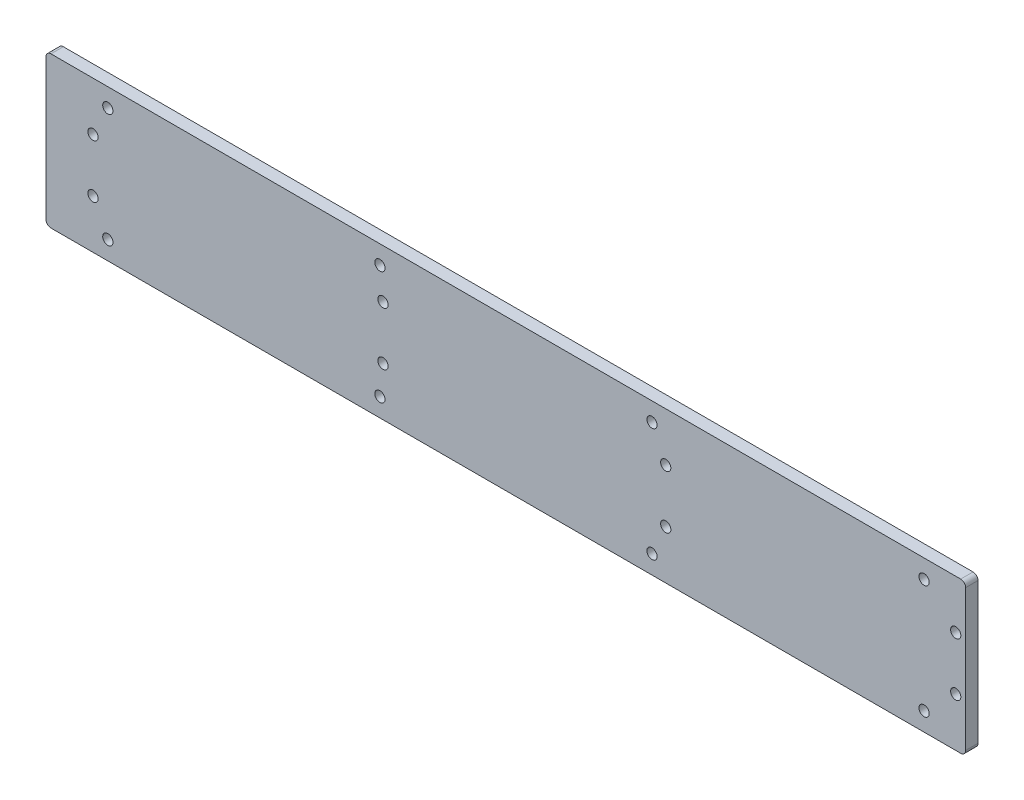
ISO-10303-21;
HEADER;
FILE_DESCRIPTION(('STEP AP214'),'2;1');
FILE_NAME('part.step','',(''),(''),'','','');
FILE_SCHEMA(('AUTOMOTIVE_DESIGN { 1 0 10303 214 1 1 1 1 }'));
ENDSEC;
DATA;
#1=APPLICATION_CONTEXT('core data for automotive mechanical design processes');
#2=APPLICATION_PROTOCOL_DEFINITION('international standard','automotive_design',2000,#1);
#3=PRODUCT_CONTEXT('',#1,'mechanical');
#4=PRODUCT('Part','Part','',(#3));
#5=PRODUCT_RELATED_PRODUCT_CATEGORY('part','',(#4));
#6=PRODUCT_DEFINITION_FORMATION('','',#4);
#7=PRODUCT_DEFINITION_CONTEXT('part definition',#1,'design');
#8=PRODUCT_DEFINITION('design','',#6,#7);
#9=PRODUCT_DEFINITION_SHAPE('','',#8);
#10=(LENGTH_UNIT() NAMED_UNIT(*) SI_UNIT(.MILLI.,.METRE.));
#11=(NAMED_UNIT(*) PLANE_ANGLE_UNIT() SI_UNIT($,.RADIAN.));
#12=(NAMED_UNIT(*) SI_UNIT($,.STERADIAN.) SOLID_ANGLE_UNIT());
#13=UNCERTAINTY_MEASURE_WITH_UNIT(LENGTH_MEASURE(1.E-05),#10,'distance_accuracy_value','');
#14=(GEOMETRIC_REPRESENTATION_CONTEXT(3) GLOBAL_UNCERTAINTY_ASSIGNED_CONTEXT((#13)) GLOBAL_UNIT_ASSIGNED_CONTEXT((#10,
#11,#12)) REPRESENTATION_CONTEXT('',''));
#15=CARTESIAN_POINT('',(0.,0.,0.));
#16=DIRECTION('',(0.,0.,1.));
#17=DIRECTION('',(1.,0.,0.));
#18=AXIS2_PLACEMENT_3D('',#15,#16,#17);
#19=CARTESIAN_POINT('',(-245.618,38.735,6.35));
#20=DIRECTION('',(0.,-1.,0.));
#21=DIRECTION('',(0.,0.,-1.));
#22=AXIS2_PLACEMENT_3D('',#19,#20,#21);
#23=PLANE('',#22);
#24=DIRECTION('',(-1.,0.,0.));
#25=VECTOR('',#24,1.);
#26=CARTESIAN_POINT('',(-245.618,38.735,6.35));
#27=LINE('',#26,#25);
#28=CARTESIAN_POINT('',(224.028,38.735,6.35));
#29=VERTEX_POINT('',#28);
#30=CARTESIAN_POINT('',(-243.078,38.735,6.35));
#31=VERTEX_POINT('',#30);
#32=EDGE_CURVE('E138',#29,#31,#27,.T.);
#33=ORIENTED_EDGE('',*,*,#32,.F.);
#34=DIRECTION('',(0.,0.,-1.));
#35=VECTOR('',#34,1.);
#36=CARTESIAN_POINT('',(224.028,38.735,6.35));
#37=LINE('',#36,#35);
#38=CARTESIAN_POINT('',(224.028,38.735,0.));
#39=VERTEX_POINT('',#38);
#40=EDGE_CURVE('E173',#29,#39,#37,.T.);
#41=ORIENTED_EDGE('',*,*,#40,.T.);
#42=DIRECTION('',(-1.,0.,0.));
#43=VECTOR('',#42,1.);
#44=CARTESIAN_POINT('',(-245.618,38.735,0.));
#45=LINE('',#44,#43);
#46=CARTESIAN_POINT('',(-243.078,38.735,0.));
#47=VERTEX_POINT('',#46);
#48=EDGE_CURVE('E185',#39,#47,#45,.T.);
#49=ORIENTED_EDGE('',*,*,#48,.T.);
#50=DIRECTION('',(0.,0.,-1.));
#51=VECTOR('',#50,1.);
#52=CARTESIAN_POINT('',(-243.078,38.735,6.35));
#53=LINE('',#52,#51);
#54=EDGE_CURVE('E170',#47,#31,#53,.F.);
#55=ORIENTED_EDGE('',*,*,#54,.T.);
#56=EDGE_LOOP('',(#33,#41,#49,#55));
#57=FACE_BOUND('',#56,.T.);
#58=ADVANCED_FACE('F39',(#57),#23,.F.);
#59=CARTESIAN_POINT('',(-245.618,-38.735,6.35));
#60=DIRECTION('',(1.,0.,0.));
#61=DIRECTION('',(0.,0.,-1.));
#62=AXIS2_PLACEMENT_3D('',#59,#60,#61);
#63=PLANE('',#62);
#64=DIRECTION('',(0.,-1.,0.));
#65=VECTOR('',#64,1.);
#66=CARTESIAN_POINT('',(-245.618,-38.735,0.));
#67=LINE('',#66,#65);
#68=CARTESIAN_POINT('',(-245.618,36.195,0.));
#69=VERTEX_POINT('',#68);
#70=CARTESIAN_POINT('',(-245.618,-36.195,0.));
#71=VERTEX_POINT('',#70);
#72=EDGE_CURVE('E140',#69,#71,#67,.T.);
#73=ORIENTED_EDGE('',*,*,#72,.T.);
#74=DIRECTION('',(0.,0.,-1.));
#75=VECTOR('',#74,1.);
#76=CARTESIAN_POINT('',(-245.618,-36.195,6.35));
#77=LINE('',#76,#75);
#78=CARTESIAN_POINT('',(-245.618,-36.195,6.35));
#79=VERTEX_POINT('',#78);
#80=EDGE_CURVE('E11',#71,#79,#77,.F.);
#81=ORIENTED_EDGE('',*,*,#80,.T.);
#82=DIRECTION('',(0.,-1.,0.));
#83=VECTOR('',#82,1.);
#84=CARTESIAN_POINT('',(-245.618,-38.735,6.35));
#85=LINE('',#84,#83);
#86=CARTESIAN_POINT('',(-245.618,36.195,6.35));
#87=VERTEX_POINT('',#86);
#88=EDGE_CURVE('E181',#87,#79,#85,.T.);
#89=ORIENTED_EDGE('',*,*,#88,.F.);
#90=DIRECTION('',(0.,0.,-1.));
#91=VECTOR('',#90,1.);
#92=CARTESIAN_POINT('',(-245.618,36.195,6.35));
#93=LINE('',#92,#91);
#94=EDGE_CURVE('E48',#87,#69,#93,.T.);
#95=ORIENTED_EDGE('',*,*,#94,.T.);
#96=EDGE_LOOP('',(#73,#81,#89,#95));
#97=FACE_BOUND('',#96,.T.);
#98=ADVANCED_FACE('F180',(#97),#63,.F.);
#99=CARTESIAN_POINT('',(-245.618,-38.735,6.35));
#100=DIRECTION('',(0.,1.,0.));
#101=DIRECTION('',(0.,0.,1.));
#102=AXIS2_PLACEMENT_3D('',#99,#100,#101);
#103=PLANE('',#102);
#104=DIRECTION('',(1.,0.,0.));
#105=VECTOR('',#104,1.);
#106=CARTESIAN_POINT('',(-245.618,-38.735,0.));
#107=LINE('',#106,#105);
#108=CARTESIAN_POINT('',(-243.078,-38.735,0.));
#109=VERTEX_POINT('',#108);
#110=CARTESIAN_POINT('',(224.028,-38.735,0.));
#111=VERTEX_POINT('',#110);
#112=EDGE_CURVE('E134',#109,#111,#107,.T.);
#113=ORIENTED_EDGE('',*,*,#112,.T.);
#114=DIRECTION('',(0.,0.,-1.));
#115=VECTOR('',#114,1.);
#116=CARTESIAN_POINT('',(224.028,-38.735,6.35));
#117=LINE('',#116,#115);
#118=CARTESIAN_POINT('',(224.028,-38.735,6.35));
#119=VERTEX_POINT('',#118);
#120=EDGE_CURVE('E110',#111,#119,#117,.F.);
#121=ORIENTED_EDGE('',*,*,#120,.T.);
#122=DIRECTION('',(1.,0.,0.));
#123=VECTOR('',#122,1.);
#124=CARTESIAN_POINT('',(-245.618,-38.735,6.35));
#125=LINE('',#124,#123);
#126=CARTESIAN_POINT('',(-243.078,-38.735,6.35));
#127=VERTEX_POINT('',#126);
#128=EDGE_CURVE('E145',#127,#119,#125,.T.);
#129=ORIENTED_EDGE('',*,*,#128,.F.);
#130=DIRECTION('',(0.,0.,-1.));
#131=VECTOR('',#130,1.);
#132=CARTESIAN_POINT('',(-243.078,-38.735,6.35));
#133=LINE('',#132,#131);
#134=EDGE_CURVE('E116',#127,#109,#133,.T.);
#135=ORIENTED_EDGE('',*,*,#134,.T.);
#136=EDGE_LOOP('',(#113,#121,#129,#135));
#137=FACE_BOUND('',#136,.T.);
#138=ADVANCED_FACE('F365',(#137),#103,.F.);
#139=CARTESIAN_POINT('',(226.568,-19.685,6.35));
#140=DIRECTION('',(-1.,0.,0.));
#141=DIRECTION('',(0.,0.,1.));
#142=AXIS2_PLACEMENT_3D('',#139,#140,#141);
#143=PLANE('',#142);
#144=DIRECTION('',(0.,1.,0.));
#145=VECTOR('',#144,1.);
#146=CARTESIAN_POINT('',(226.568,19.685,6.35));
#147=LINE('',#146,#145);
#148=CARTESIAN_POINT('',(226.568,-36.195,6.35));
#149=VERTEX_POINT('',#148);
#150=CARTESIAN_POINT('',(226.568,36.195,6.35));
#151=VERTEX_POINT('',#150);
#152=EDGE_CURVE('E126',#149,#151,#147,.T.);
#153=ORIENTED_EDGE('',*,*,#152,.F.);
#154=DIRECTION('',(0.,0.,-1.));
#155=VECTOR('',#154,1.);
#156=CARTESIAN_POINT('',(226.568,-36.195,6.35));
#157=LINE('',#156,#155);
#158=CARTESIAN_POINT('',(226.568,-36.195,0.));
#159=VERTEX_POINT('',#158);
#160=EDGE_CURVE('E109',#149,#159,#157,.T.);
#161=ORIENTED_EDGE('',*,*,#160,.T.);
#162=DIRECTION('',(0.,1.,0.));
#163=VECTOR('',#162,1.);
#164=CARTESIAN_POINT('',(226.568,-19.685,0.));
#165=LINE('',#164,#163);
#166=CARTESIAN_POINT('',(226.568,36.195,0.));
#167=VERTEX_POINT('',#166);
#168=EDGE_CURVE('E123',#159,#167,#165,.T.);
#169=ORIENTED_EDGE('',*,*,#168,.T.);
#170=DIRECTION('',(0.,0.,-1.));
#171=VECTOR('',#170,1.);
#172=CARTESIAN_POINT('',(226.568,36.195,6.35));
#173=LINE('',#172,#171);
#174=EDGE_CURVE('E129',#167,#151,#173,.F.);
#175=ORIENTED_EDGE('',*,*,#174,.T.);
#176=EDGE_LOOP('',(#153,#161,#169,#175));
#177=FACE_BOUND('',#176,.T.);
#178=ADVANCED_FACE('F122',(#177),#143,.F.);
#179=CARTESIAN_POINT('',(0.,0.,6.35));
#180=DIRECTION('',(0.,0.,-1.));
#181=DIRECTION('',(-1.,0.,0.));
#182=AXIS2_PLACEMENT_3D('',#179,#180,#181);
#183=PLANE('',#182);
#184=CARTESIAN_POINT('',(-74.168,29.21,6.35));
#185=DIRECTION('',(0.,0.,1.));
#186=DIRECTION('',(1.,0.,0.));
#187=AXIS2_PLACEMENT_3D('',#184,#185,#186);
#188=CIRCLE('',#187,2.63125);
#189=CARTESIAN_POINT('',(-71.53675,29.21,6.35));
#190=VERTEX_POINT('',#189);
#191=EDGE_CURVE('E294',#190,#190,#188,.T.);
#192=ORIENTED_EDGE('',*,*,#191,.F.);
#193=EDGE_LOOP('',(#192));
#194=FACE_BOUND('',#193,.T.);
#195=CARTESIAN_POINT('',(65.532,29.21,6.35));
#196=DIRECTION('',(0.,0.,1.));
#197=DIRECTION('',(1.,0.,0.));
#198=AXIS2_PLACEMENT_3D('',#195,#196,#197);
#199=CIRCLE('',#198,2.63125);
#200=CARTESIAN_POINT('',(68.1632499999999,29.21,6.35));
#201=VERTEX_POINT('',#200);
#202=EDGE_CURVE('E286',#201,#201,#199,.T.);
#203=ORIENTED_EDGE('',*,*,#202,.F.);
#204=EDGE_LOOP('',(#203));
#205=FACE_BOUND('',#204,.T.);
#206=CARTESIAN_POINT('',(205.232,29.21,6.35));
#207=DIRECTION('',(0.,0.,1.));
#208=DIRECTION('',(1.,0.,0.));
#209=AXIS2_PLACEMENT_3D('',#206,#207,#208);
#210=CIRCLE('',#209,2.63124999999999);
#211=CARTESIAN_POINT('',(207.86325,29.21,6.35));
#212=VERTEX_POINT('',#211);
#213=EDGE_CURVE('E278',#212,#212,#210,.T.);
#214=ORIENTED_EDGE('',*,*,#213,.F.);
#215=EDGE_LOOP('',(#214));
#216=FACE_BOUND('',#215,.T.);
#217=CARTESIAN_POINT('',(205.232,-29.21,6.35));
#218=DIRECTION('',(0.,0.,1.));
#219=DIRECTION('',(-1.,0.,0.));
#220=AXIS2_PLACEMENT_3D('',#217,#218,#219);
#221=CIRCLE('',#220,2.63124999999999);
#222=CARTESIAN_POINT('',(202.60075,-29.21,6.35));
#223=VERTEX_POINT('',#222);
#224=EDGE_CURVE('E269',#223,#223,#221,.T.);
#225=ORIENTED_EDGE('',*,*,#224,.F.);
#226=EDGE_LOOP('',(#225));
#227=FACE_BOUND('',#226,.T.);
#228=CARTESIAN_POINT('',(65.532,-29.21,6.35));
#229=DIRECTION('',(0.,0.,1.));
#230=DIRECTION('',(-1.,0.,0.));
#231=AXIS2_PLACEMENT_3D('',#228,#229,#230);
#232=CIRCLE('',#231,2.63125);
#233=CARTESIAN_POINT('',(62.90075,-29.21,6.35));
#234=VERTEX_POINT('',#233);
#235=EDGE_CURVE('E317',#234,#234,#232,.T.);
#236=ORIENTED_EDGE('',*,*,#235,.F.);
#237=EDGE_LOOP('',(#236));
#238=FACE_BOUND('',#237,.T.);
#239=CARTESIAN_POINT('',(-74.168,-29.21,6.35));
#240=DIRECTION('',(0.,0.,1.));
#241=DIRECTION('',(-1.,0.,0.));
#242=AXIS2_PLACEMENT_3D('',#239,#240,#241);
#243=CIRCLE('',#242,2.63125);
#244=CARTESIAN_POINT('',(-76.79925,-29.21,6.35));
#245=VERTEX_POINT('',#244);
#246=EDGE_CURVE('E309',#245,#245,#243,.T.);
#247=ORIENTED_EDGE('',*,*,#246,.F.);
#248=EDGE_LOOP('',(#247));
#249=FACE_BOUND('',#248,.T.);
#250=CARTESIAN_POINT('',(-213.868,-29.21,6.35));
#251=DIRECTION('',(0.,0.,1.));
#252=DIRECTION('',(-1.,0.,0.));
#253=AXIS2_PLACEMENT_3D('',#250,#251,#252);
#254=CIRCLE('',#253,2.63124999999999);
#255=CARTESIAN_POINT('',(-216.49925,-29.21,6.35));
#256=VERTEX_POINT('',#255);
#257=EDGE_CURVE('E301',#256,#256,#254,.T.);
#258=ORIENTED_EDGE('',*,*,#257,.F.);
#259=EDGE_LOOP('',(#258));
#260=FACE_BOUND('',#259,.T.);
#261=CARTESIAN_POINT('',(-213.868,29.21,6.35));
#262=DIRECTION('',(0.,0.,1.));
#263=DIRECTION('',(1.,0.,0.));
#264=AXIS2_PLACEMENT_3D('',#261,#262,#263);
#265=CIRCLE('',#264,2.63124999999999);
#266=CARTESIAN_POINT('',(-211.23675,29.21,6.35));
#267=VERTEX_POINT('',#266);
#268=EDGE_CURVE('E261',#267,#267,#265,.T.);
#269=ORIENTED_EDGE('',*,*,#268,.F.);
#270=EDGE_LOOP('',(#269));
#271=FACE_BOUND('',#270,.T.);
#272=CARTESIAN_POINT('',(-221.488,-13.68025,6.35));
#273=DIRECTION('',(0.,0.,1.));
#274=DIRECTION('',(1.,0.,0.));
#275=AXIS2_PLACEMENT_3D('',#272,#273,#274);
#276=CIRCLE('',#275,2.63124999999999);
#277=CARTESIAN_POINT('',(-218.85675,-13.68025,6.35));
#278=VERTEX_POINT('',#277);
#279=EDGE_CURVE('E230',#278,#278,#276,.T.);
#280=ORIENTED_EDGE('',*,*,#279,.F.);
#281=EDGE_LOOP('',(#280));
#282=FACE_BOUND('',#281,.T.);
#283=CARTESIAN_POINT('',(221.488,-13.68025,6.35));
#284=DIRECTION('',(0.,0.,1.));
#285=DIRECTION('',(-1.,0.,0.));
#286=AXIS2_PLACEMENT_3D('',#283,#284,#285);
#287=CIRCLE('',#286,2.63124999999999);
#288=CARTESIAN_POINT('',(218.85675,-13.68025,6.35));
#289=VERTEX_POINT('',#288);
#290=EDGE_CURVE('E222',#289,#289,#287,.T.);
#291=ORIENTED_EDGE('',*,*,#290,.F.);
#292=EDGE_LOOP('',(#291));
#293=FACE_BOUND('',#292,.T.);
#294=CARTESIAN_POINT('',(221.488,13.68025,6.35));
#295=DIRECTION('',(0.,0.,1.));
#296=DIRECTION('',(-1.,0.,0.));
#297=AXIS2_PLACEMENT_3D('',#294,#295,#296);
#298=CIRCLE('',#297,2.63124999999999);
#299=CARTESIAN_POINT('',(218.85675,13.68025,6.35));
#300=VERTEX_POINT('',#299);
#301=EDGE_CURVE('E214',#300,#300,#298,.T.);
#302=ORIENTED_EDGE('',*,*,#301,.F.);
#303=EDGE_LOOP('',(#302));
#304=FACE_BOUND('',#303,.T.);
#305=CARTESIAN_POINT('',(-72.588782178,13.68025,6.35));
#306=DIRECTION('',(0.,0.,1.));
#307=DIRECTION('',(1.,0.,0.));
#308=AXIS2_PLACEMENT_3D('',#305,#306,#307);
#309=CIRCLE('',#308,2.63125);
#310=CARTESIAN_POINT('',(-69.957532178,13.68025,6.35));
#311=VERTEX_POINT('',#310);
#312=EDGE_CURVE('E205',#311,#311,#309,.T.);
#313=ORIENTED_EDGE('',*,*,#312,.F.);
#314=EDGE_LOOP('',(#313));
#315=FACE_BOUND('',#314,.T.);
#316=CARTESIAN_POINT('',(72.588782178,-13.68025,6.35));
#317=DIRECTION('',(0.,0.,1.));
#318=DIRECTION('',(-1.,0.,0.));
#319=AXIS2_PLACEMENT_3D('',#316,#317,#318);
#320=CIRCLE('',#319,2.63125);
#321=CARTESIAN_POINT('',(69.957532178,-13.68025,6.35));
#322=VERTEX_POINT('',#321);
#323=EDGE_CURVE('E253',#322,#322,#320,.T.);
#324=ORIENTED_EDGE('',*,*,#323,.F.);
#325=EDGE_LOOP('',(#324));
#326=FACE_BOUND('',#325,.T.);
#327=CARTESIAN_POINT('',(72.588782178,13.68025,6.35));
#328=DIRECTION('',(0.,0.,1.));
#329=DIRECTION('',(1.,0.,0.));
#330=AXIS2_PLACEMENT_3D('',#327,#328,#329);
#331=CIRCLE('',#330,2.63125);
#332=CARTESIAN_POINT('',(75.220032178,13.68025,6.35));
#333=VERTEX_POINT('',#332);
#334=EDGE_CURVE('E237',#333,#333,#331,.T.);
#335=ORIENTED_EDGE('',*,*,#334,.F.);
#336=EDGE_LOOP('',(#335));
#337=FACE_BOUND('',#336,.T.);
#338=CARTESIAN_POINT('',(-72.588782178,-13.68025,6.35));
#339=DIRECTION('',(0.,0.,1.));
#340=DIRECTION('',(-1.,0.,0.));
#341=AXIS2_PLACEMENT_3D('',#338,#339,#340);
#342=CIRCLE('',#341,2.63125);
#343=CARTESIAN_POINT('',(-75.220032178,-13.68025,6.35));
#344=VERTEX_POINT('',#343);
#345=EDGE_CURVE('E246',#344,#344,#342,.T.);
#346=ORIENTED_EDGE('',*,*,#345,.F.);
#347=EDGE_LOOP('',(#346));
#348=FACE_BOUND('',#347,.T.);
#349=CARTESIAN_POINT('',(-221.488,13.68025,6.35));
#350=DIRECTION('',(0.,0.,1.));
#351=DIRECTION('',(1.,0.,0.));
#352=AXIS2_PLACEMENT_3D('',#349,#350,#351);
#353=CIRCLE('',#352,2.63124999999999);
#354=CARTESIAN_POINT('',(-218.85675,13.68025,6.35));
#355=VERTEX_POINT('',#354);
#356=EDGE_CURVE('E197',#355,#355,#353,.T.);
#357=ORIENTED_EDGE('',*,*,#356,.F.);
#358=EDGE_LOOP('',(#357));
#359=FACE_BOUND('',#358,.T.);
#360=ORIENTED_EDGE('',*,*,#128,.T.);
#361=CARTESIAN_POINT('',(224.028,-36.195,6.35));
#362=DIRECTION('',(0.,0.,-1.));
#363=DIRECTION('',(-1.,0.,0.));
#364=AXIS2_PLACEMENT_3D('',#361,#362,#363);
#365=CIRCLE('',#364,2.54);
#366=EDGE_CURVE('E167',#119,#149,#365,.F.);
#367=ORIENTED_EDGE('',*,*,#366,.T.);
#368=ORIENTED_EDGE('',*,*,#152,.T.);
#369=CARTESIAN_POINT('',(224.028,36.195,6.35));
#370=DIRECTION('',(0.,0.,-1.));
#371=DIRECTION('',(-1.,0.,0.));
#372=AXIS2_PLACEMENT_3D('',#369,#370,#371);
#373=CIRCLE('',#372,2.54);
#374=EDGE_CURVE('E164',#151,#29,#373,.F.);
#375=ORIENTED_EDGE('',*,*,#374,.T.);
#376=ORIENTED_EDGE('',*,*,#32,.T.);
#377=CARTESIAN_POINT('',(-243.078,36.195,6.35));
#378=DIRECTION('',(0.,0.,-1.));
#379=DIRECTION('',(-1.,0.,0.));
#380=AXIS2_PLACEMENT_3D('',#377,#378,#379);
#381=CIRCLE('',#380,2.54);
#382=EDGE_CURVE('E60',#31,#87,#381,.F.);
#383=ORIENTED_EDGE('',*,*,#382,.T.);
#384=ORIENTED_EDGE('',*,*,#88,.T.);
#385=CARTESIAN_POINT('',(-243.078,-36.195,6.35));
#386=DIRECTION('',(0.,0.,-1.));
#387=DIRECTION('',(-1.,0.,0.));
#388=AXIS2_PLACEMENT_3D('',#385,#386,#387);
#389=CIRCLE('',#388,2.54);
#390=EDGE_CURVE('E161',#79,#127,#389,.F.);
#391=ORIENTED_EDGE('',*,*,#390,.T.);
#392=EDGE_LOOP('',(#360,#367,#368,#375,#376,#383,#384,#391));
#393=FACE_BOUND('',#392,.T.);
#394=ADVANCED_FACE('F335',(#194,#205,#216,#227,#238,#249,#260,#271,#282,#293,#304,#315,#326,
#337,#348,#359,#393),#183,.F.);
#395=CARTESIAN_POINT('',(0.,0.,0.));
#396=DIRECTION('',(0.,0.,-1.));
#397=DIRECTION('',(-1.,0.,0.));
#398=AXIS2_PLACEMENT_3D('',#395,#396,#397);
#399=PLANE('',#398);
#400=CARTESIAN_POINT('',(-74.168,29.21,0.));
#401=DIRECTION('',(0.,0.,1.));
#402=DIRECTION('',(1.,0.,0.));
#403=AXIS2_PLACEMENT_3D('',#400,#401,#402);
#404=CIRCLE('',#403,2.63125);
#405=CARTESIAN_POINT('',(-71.53675,29.21,0.));
#406=VERTEX_POINT('',#405);
#407=EDGE_CURVE('E265',#406,#406,#404,.T.);
#408=ORIENTED_EDGE('',*,*,#407,.T.);
#409=EDGE_LOOP('',(#408));
#410=FACE_BOUND('',#409,.T.);
#411=CARTESIAN_POINT('',(65.532,29.21,0.));
#412=DIRECTION('',(0.,0.,1.));
#413=DIRECTION('',(1.,0.,0.));
#414=AXIS2_PLACEMENT_3D('',#411,#412,#413);
#415=CIRCLE('',#414,2.63125);
#416=CARTESIAN_POINT('',(68.1632499999999,29.21,0.));
#417=VERTEX_POINT('',#416);
#418=EDGE_CURVE('E290',#417,#417,#415,.T.);
#419=ORIENTED_EDGE('',*,*,#418,.T.);
#420=EDGE_LOOP('',(#419));
#421=FACE_BOUND('',#420,.T.);
#422=CARTESIAN_POINT('',(205.232,29.21,0.));
#423=DIRECTION('',(0.,0.,1.));
#424=DIRECTION('',(1.,0.,0.));
#425=AXIS2_PLACEMENT_3D('',#422,#423,#424);
#426=CIRCLE('',#425,2.63124999999999);
#427=CARTESIAN_POINT('',(207.86325,29.21,0.));
#428=VERTEX_POINT('',#427);
#429=EDGE_CURVE('E282',#428,#428,#426,.T.);
#430=ORIENTED_EDGE('',*,*,#429,.T.);
#431=EDGE_LOOP('',(#430));
#432=FACE_BOUND('',#431,.T.);
#433=CARTESIAN_POINT('',(205.232,-29.21,0.));
#434=DIRECTION('',(0.,0.,1.));
#435=DIRECTION('',(-1.,0.,0.));
#436=AXIS2_PLACEMENT_3D('',#433,#434,#435);
#437=CIRCLE('',#436,2.63124999999999);
#438=CARTESIAN_POINT('',(202.60075,-29.21,0.));
#439=VERTEX_POINT('',#438);
#440=EDGE_CURVE('E273',#439,#439,#437,.T.);
#441=ORIENTED_EDGE('',*,*,#440,.T.);
#442=EDGE_LOOP('',(#441));
#443=FACE_BOUND('',#442,.T.);
#444=CARTESIAN_POINT('',(65.532,-29.21,0.));
#445=DIRECTION('',(0.,0.,1.));
#446=DIRECTION('',(-1.,0.,0.));
#447=AXIS2_PLACEMENT_3D('',#444,#445,#446);
#448=CIRCLE('',#447,2.63125);
#449=CARTESIAN_POINT('',(62.90075,-29.21,0.));
#450=VERTEX_POINT('',#449);
#451=EDGE_CURVE('E274',#450,#450,#448,.T.);
#452=ORIENTED_EDGE('',*,*,#451,.T.);
#453=EDGE_LOOP('',(#452));
#454=FACE_BOUND('',#453,.T.);
#455=CARTESIAN_POINT('',(-74.168,-29.21,0.));
#456=DIRECTION('',(0.,0.,1.));
#457=DIRECTION('',(-1.,0.,0.));
#458=AXIS2_PLACEMENT_3D('',#455,#456,#457);
#459=CIRCLE('',#458,2.63125);
#460=CARTESIAN_POINT('',(-76.79925,-29.21,0.));
#461=VERTEX_POINT('',#460);
#462=EDGE_CURVE('E313',#461,#461,#459,.T.);
#463=ORIENTED_EDGE('',*,*,#462,.T.);
#464=EDGE_LOOP('',(#463));
#465=FACE_BOUND('',#464,.T.);
#466=CARTESIAN_POINT('',(-213.868,-29.21,0.));
#467=DIRECTION('',(0.,0.,1.));
#468=DIRECTION('',(-1.,0.,0.));
#469=AXIS2_PLACEMENT_3D('',#466,#467,#468);
#470=CIRCLE('',#469,2.63124999999999);
#471=CARTESIAN_POINT('',(-216.49925,-29.21,0.));
#472=VERTEX_POINT('',#471);
#473=EDGE_CURVE('E305',#472,#472,#470,.T.);
#474=ORIENTED_EDGE('',*,*,#473,.T.);
#475=EDGE_LOOP('',(#474));
#476=FACE_BOUND('',#475,.T.);
#477=CARTESIAN_POINT('',(-213.868,29.21,0.));
#478=DIRECTION('',(0.,0.,1.));
#479=DIRECTION('',(1.,0.,0.));
#480=AXIS2_PLACEMENT_3D('',#477,#478,#479);
#481=CIRCLE('',#480,2.63124999999999);
#482=CARTESIAN_POINT('',(-211.23675,29.21,0.));
#483=VERTEX_POINT('',#482);
#484=EDGE_CURVE('E257',#483,#483,#481,.T.);
#485=ORIENTED_EDGE('',*,*,#484,.T.);
#486=EDGE_LOOP('',(#485));
#487=FACE_BOUND('',#486,.T.);
#488=CARTESIAN_POINT('',(-221.488,-13.68025,0.));
#489=DIRECTION('',(0.,0.,1.));
#490=DIRECTION('',(1.,0.,0.));
#491=AXIS2_PLACEMENT_3D('',#488,#489,#490);
#492=CIRCLE('',#491,2.63124999999999);
#493=CARTESIAN_POINT('',(-218.85675,-13.68025,0.));
#494=VERTEX_POINT('',#493);
#495=EDGE_CURVE('E201',#494,#494,#492,.T.);
#496=ORIENTED_EDGE('',*,*,#495,.T.);
#497=EDGE_LOOP('',(#496));
#498=FACE_BOUND('',#497,.T.);
#499=CARTESIAN_POINT('',(221.488,-13.68025,0.));
#500=DIRECTION('',(0.,0.,1.));
#501=DIRECTION('',(-1.,0.,0.));
#502=AXIS2_PLACEMENT_3D('',#499,#500,#501);
#503=CIRCLE('',#502,2.63124999999999);
#504=CARTESIAN_POINT('',(218.85675,-13.68025,0.));
#505=VERTEX_POINT('',#504);
#506=EDGE_CURVE('E226',#505,#505,#503,.T.);
#507=ORIENTED_EDGE('',*,*,#506,.T.);
#508=EDGE_LOOP('',(#507));
#509=FACE_BOUND('',#508,.T.);
#510=CARTESIAN_POINT('',(221.488,13.68025,0.));
#511=DIRECTION('',(0.,0.,1.));
#512=DIRECTION('',(-1.,0.,0.));
#513=AXIS2_PLACEMENT_3D('',#510,#511,#512);
#514=CIRCLE('',#513,2.63124999999999);
#515=CARTESIAN_POINT('',(218.85675,13.68025,0.));
#516=VERTEX_POINT('',#515);
#517=EDGE_CURVE('E218',#516,#516,#514,.T.);
#518=ORIENTED_EDGE('',*,*,#517,.T.);
#519=EDGE_LOOP('',(#518));
#520=FACE_BOUND('',#519,.T.);
#521=CARTESIAN_POINT('',(-72.588782178,13.68025,0.));
#522=DIRECTION('',(0.,0.,1.));
#523=DIRECTION('',(1.,0.,0.));
#524=AXIS2_PLACEMENT_3D('',#521,#522,#523);
#525=CIRCLE('',#524,2.63125);
#526=CARTESIAN_POINT('',(-69.957532178,13.68025,0.));
#527=VERTEX_POINT('',#526);
#528=EDGE_CURVE('E209',#527,#527,#525,.T.);
#529=ORIENTED_EDGE('',*,*,#528,.T.);
#530=EDGE_LOOP('',(#529));
#531=FACE_BOUND('',#530,.T.);
#532=CARTESIAN_POINT('',(72.588782178,-13.68025,0.));
#533=DIRECTION('',(0.,0.,1.));
#534=DIRECTION('',(-1.,0.,0.));
#535=AXIS2_PLACEMENT_3D('',#532,#533,#534);
#536=CIRCLE('',#535,2.63125);
#537=CARTESIAN_POINT('',(69.957532178,-13.68025,0.));
#538=VERTEX_POINT('',#537);
#539=EDGE_CURVE('E242',#538,#538,#536,.T.);
#540=ORIENTED_EDGE('',*,*,#539,.T.);
#541=EDGE_LOOP('',(#540));
#542=FACE_BOUND('',#541,.T.);
#543=CARTESIAN_POINT('',(72.588782178,13.68025,0.));
#544=DIRECTION('',(0.,0.,1.));
#545=DIRECTION('',(1.,0.,0.));
#546=AXIS2_PLACEMENT_3D('',#543,#544,#545);
#547=CIRCLE('',#546,2.63125);
#548=CARTESIAN_POINT('',(75.220032178,13.68025,0.));
#549=VERTEX_POINT('',#548);
#550=EDGE_CURVE('E241',#549,#549,#547,.T.);
#551=ORIENTED_EDGE('',*,*,#550,.T.);
#552=EDGE_LOOP('',(#551));
#553=FACE_BOUND('',#552,.T.);
#554=CARTESIAN_POINT('',(-72.588782178,-13.68025,0.));
#555=DIRECTION('',(0.,0.,1.));
#556=DIRECTION('',(-1.,0.,0.));
#557=AXIS2_PLACEMENT_3D('',#554,#555,#556);
#558=CIRCLE('',#557,2.63125);
#559=CARTESIAN_POINT('',(-75.220032178,-13.68025,0.));
#560=VERTEX_POINT('',#559);
#561=EDGE_CURVE('E210',#560,#560,#558,.T.);
#562=ORIENTED_EDGE('',*,*,#561,.T.);
#563=EDGE_LOOP('',(#562));
#564=FACE_BOUND('',#563,.T.);
#565=CARTESIAN_POINT('',(-221.488,13.68025,0.));
#566=DIRECTION('',(0.,0.,1.));
#567=DIRECTION('',(1.,0.,0.));
#568=AXIS2_PLACEMENT_3D('',#565,#566,#567);
#569=CIRCLE('',#568,2.63124999999999);
#570=CARTESIAN_POINT('',(-218.85675,13.68025,0.));
#571=VERTEX_POINT('',#570);
#572=EDGE_CURVE('E187',#571,#571,#569,.T.);
#573=ORIENTED_EDGE('',*,*,#572,.T.);
#574=EDGE_LOOP('',(#573));
#575=FACE_BOUND('',#574,.T.);
#576=ORIENTED_EDGE('',*,*,#168,.F.);
#577=CARTESIAN_POINT('',(224.028,-36.195,0.));
#578=DIRECTION('',(0.,0.,-1.));
#579=DIRECTION('',(-1.,0.,0.));
#580=AXIS2_PLACEMENT_3D('',#577,#578,#579);
#581=CIRCLE('',#580,2.54);
#582=EDGE_CURVE('E105',#159,#111,#581,.T.);
#583=ORIENTED_EDGE('',*,*,#582,.T.);
#584=ORIENTED_EDGE('',*,*,#112,.F.);
#585=CARTESIAN_POINT('',(-243.078,-36.195,0.));
#586=DIRECTION('',(0.,0.,-1.));
#587=DIRECTION('',(-1.,0.,0.));
#588=AXIS2_PLACEMENT_3D('',#585,#586,#587);
#589=CIRCLE('',#588,2.54);
#590=EDGE_CURVE('E149',#109,#71,#589,.T.);
#591=ORIENTED_EDGE('',*,*,#590,.T.);
#592=ORIENTED_EDGE('',*,*,#72,.F.);
#593=CARTESIAN_POINT('',(-243.078,36.195,0.));
#594=DIRECTION('',(0.,0.,-1.));
#595=DIRECTION('',(-1.,0.,0.));
#596=AXIS2_PLACEMENT_3D('',#593,#594,#595);
#597=CIRCLE('',#596,2.54);
#598=EDGE_CURVE('E128',#69,#47,#597,.T.);
#599=ORIENTED_EDGE('',*,*,#598,.T.);
#600=ORIENTED_EDGE('',*,*,#48,.F.);
#601=CARTESIAN_POINT('',(224.028,36.195,0.));
#602=DIRECTION('',(0.,0.,-1.));
#603=DIRECTION('',(-1.,0.,0.));
#604=AXIS2_PLACEMENT_3D('',#601,#602,#603);
#605=CIRCLE('',#604,2.54);
#606=EDGE_CURVE('E117',#39,#167,#605,.T.);
#607=ORIENTED_EDGE('',*,*,#606,.T.);
#608=EDGE_LOOP('',(#576,#583,#584,#591,#592,#599,#600,#607));
#609=FACE_BOUND('',#608,.T.);
#610=ADVANCED_FACE('F131',(#410,#421,#432,#443,#454,#465,#476,#487,#498,#509,#520,#531,#542,
#553,#564,#575,#609),#399,.T.);
#611=CARTESIAN_POINT('',(-221.488,13.68025,0.));
#612=DIRECTION('',(0.,0.,1.));
#613=DIRECTION('',(1.,0.,0.));
#614=AXIS2_PLACEMENT_3D('',#611,#612,#613);
#615=CYLINDRICAL_SURFACE('',#614,2.63124999999999);
#616=ORIENTED_EDGE('',*,*,#572,.F.);
#617=EDGE_LOOP('',(#616));
#618=FACE_BOUND('',#617,.T.);
#619=ORIENTED_EDGE('',*,*,#356,.T.);
#620=EDGE_LOOP('',(#619));
#621=FACE_BOUND('',#620,.T.);
#622=ADVANCED_FACE('F426',(#618,#621),#615,.F.);
#623=CARTESIAN_POINT('',(-72.588782178,-13.68025,0.));
#624=DIRECTION('',(0.,0.,1.));
#625=DIRECTION('',(1.,0.,0.));
#626=AXIS2_PLACEMENT_3D('',#623,#624,#625);
#627=CYLINDRICAL_SURFACE('',#626,2.63125);
#628=ORIENTED_EDGE('',*,*,#561,.F.);
#629=EDGE_LOOP('',(#628));
#630=FACE_BOUND('',#629,.T.);
#631=ORIENTED_EDGE('',*,*,#345,.T.);
#632=EDGE_LOOP('',(#631));
#633=FACE_BOUND('',#632,.T.);
#634=ADVANCED_FACE('F423',(#630,#633),#627,.F.);
#635=CARTESIAN_POINT('',(72.588782178,13.68025,0.));
#636=DIRECTION('',(0.,0.,1.));
#637=DIRECTION('',(1.,0.,0.));
#638=AXIS2_PLACEMENT_3D('',#635,#636,#637);
#639=CYLINDRICAL_SURFACE('',#638,2.63125);
#640=ORIENTED_EDGE('',*,*,#550,.F.);
#641=EDGE_LOOP('',(#640));
#642=FACE_BOUND('',#641,.T.);
#643=ORIENTED_EDGE('',*,*,#334,.T.);
#644=EDGE_LOOP('',(#643));
#645=FACE_BOUND('',#644,.T.);
#646=ADVANCED_FACE('F421',(#642,#645),#639,.F.);
#647=CARTESIAN_POINT('',(72.588782178,-13.68025,0.));
#648=DIRECTION('',(0.,0.,1.));
#649=DIRECTION('',(1.,0.,0.));
#650=AXIS2_PLACEMENT_3D('',#647,#648,#649);
#651=CYLINDRICAL_SURFACE('',#650,2.63125);
#652=ORIENTED_EDGE('',*,*,#539,.F.);
#653=EDGE_LOOP('',(#652));
#654=FACE_BOUND('',#653,.T.);
#655=ORIENTED_EDGE('',*,*,#323,.T.);
#656=EDGE_LOOP('',(#655));
#657=FACE_BOUND('',#656,.T.);
#658=ADVANCED_FACE('F417',(#654,#657),#651,.F.);
#659=CARTESIAN_POINT('',(-72.588782178,13.68025,0.));
#660=DIRECTION('',(0.,0.,1.));
#661=DIRECTION('',(1.,0.,0.));
#662=AXIS2_PLACEMENT_3D('',#659,#660,#661);
#663=CYLINDRICAL_SURFACE('',#662,2.63125);
#664=ORIENTED_EDGE('',*,*,#528,.F.);
#665=EDGE_LOOP('',(#664));
#666=FACE_BOUND('',#665,.T.);
#667=ORIENTED_EDGE('',*,*,#312,.T.);
#668=EDGE_LOOP('',(#667));
#669=FACE_BOUND('',#668,.T.);
#670=ADVANCED_FACE('F420',(#666,#669),#663,.F.);
#671=CARTESIAN_POINT('',(221.488,13.68025,0.));
#672=DIRECTION('',(0.,0.,1.));
#673=DIRECTION('',(1.,0.,0.));
#674=AXIS2_PLACEMENT_3D('',#671,#672,#673);
#675=CYLINDRICAL_SURFACE('',#674,2.63124999999999);
#676=ORIENTED_EDGE('',*,*,#517,.F.);
#677=EDGE_LOOP('',(#676));
#678=FACE_BOUND('',#677,.T.);
#679=ORIENTED_EDGE('',*,*,#301,.T.);
#680=EDGE_LOOP('',(#679));
#681=FACE_BOUND('',#680,.T.);
#682=ADVANCED_FACE('F437',(#678,#681),#675,.F.);
#683=CARTESIAN_POINT('',(221.488,-13.68025,0.));
#684=DIRECTION('',(0.,0.,1.));
#685=DIRECTION('',(1.,0.,0.));
#686=AXIS2_PLACEMENT_3D('',#683,#684,#685);
#687=CYLINDRICAL_SURFACE('',#686,2.63124999999999);
#688=ORIENTED_EDGE('',*,*,#506,.F.);
#689=EDGE_LOOP('',(#688));
#690=FACE_BOUND('',#689,.T.);
#691=ORIENTED_EDGE('',*,*,#290,.T.);
#692=EDGE_LOOP('',(#691));
#693=FACE_BOUND('',#692,.T.);
#694=ADVANCED_FACE('F433',(#690,#693),#687,.F.);
#695=CARTESIAN_POINT('',(-221.488,-13.68025,0.));
#696=DIRECTION('',(0.,0.,1.));
#697=DIRECTION('',(1.,0.,0.));
#698=AXIS2_PLACEMENT_3D('',#695,#696,#697);
#699=CYLINDRICAL_SURFACE('',#698,2.63124999999999);
#700=ORIENTED_EDGE('',*,*,#495,.F.);
#701=EDGE_LOOP('',(#700));
#702=FACE_BOUND('',#701,.T.);
#703=ORIENTED_EDGE('',*,*,#279,.T.);
#704=EDGE_LOOP('',(#703));
#705=FACE_BOUND('',#704,.T.);
#706=ADVANCED_FACE('F415',(#702,#705),#699,.F.);
#707=CARTESIAN_POINT('',(-213.868,29.21,0.));
#708=DIRECTION('',(0.,0.,1.));
#709=DIRECTION('',(1.,0.,0.));
#710=AXIS2_PLACEMENT_3D('',#707,#708,#709);
#711=CYLINDRICAL_SURFACE('',#710,2.63124999999999);
#712=ORIENTED_EDGE('',*,*,#484,.F.);
#713=EDGE_LOOP('',(#712));
#714=FACE_BOUND('',#713,.T.);
#715=ORIENTED_EDGE('',*,*,#268,.T.);
#716=EDGE_LOOP('',(#715));
#717=FACE_BOUND('',#716,.T.);
#718=ADVANCED_FACE('F412',(#714,#717),#711,.F.);
#719=CARTESIAN_POINT('',(-213.868,-29.21,0.));
#720=DIRECTION('',(0.,0.,1.));
#721=DIRECTION('',(1.,0.,0.));
#722=AXIS2_PLACEMENT_3D('',#719,#720,#721);
#723=CYLINDRICAL_SURFACE('',#722,2.63124999999999);
#724=ORIENTED_EDGE('',*,*,#473,.F.);
#725=EDGE_LOOP('',(#724));
#726=FACE_BOUND('',#725,.T.);
#727=ORIENTED_EDGE('',*,*,#257,.T.);
#728=EDGE_LOOP('',(#727));
#729=FACE_BOUND('',#728,.T.);
#730=ADVANCED_FACE('F403',(#726,#729),#723,.F.);
#731=CARTESIAN_POINT('',(-74.168,-29.21,0.));
#732=DIRECTION('',(0.,0.,1.));
#733=DIRECTION('',(1.,0.,0.));
#734=AXIS2_PLACEMENT_3D('',#731,#732,#733);
#735=CYLINDRICAL_SURFACE('',#734,2.63125);
#736=ORIENTED_EDGE('',*,*,#462,.F.);
#737=EDGE_LOOP('',(#736));
#738=FACE_BOUND('',#737,.T.);
#739=ORIENTED_EDGE('',*,*,#246,.T.);
#740=EDGE_LOOP('',(#739));
#741=FACE_BOUND('',#740,.T.);
#742=ADVANCED_FACE('F331',(#738,#741),#735,.F.);
#743=CARTESIAN_POINT('',(65.532,-29.21,0.));
#744=DIRECTION('',(0.,0.,1.));
#745=DIRECTION('',(1.,0.,0.));
#746=AXIS2_PLACEMENT_3D('',#743,#744,#745);
#747=CYLINDRICAL_SURFACE('',#746,2.63125);
#748=ORIENTED_EDGE('',*,*,#451,.F.);
#749=EDGE_LOOP('',(#748));
#750=FACE_BOUND('',#749,.T.);
#751=ORIENTED_EDGE('',*,*,#235,.T.);
#752=EDGE_LOOP('',(#751));
#753=FACE_BOUND('',#752,.T.);
#754=ADVANCED_FACE('F327',(#750,#753),#747,.F.);
#755=CARTESIAN_POINT('',(205.232,-29.21,0.));
#756=DIRECTION('',(0.,0.,1.));
#757=DIRECTION('',(1.,0.,0.));
#758=AXIS2_PLACEMENT_3D('',#755,#756,#757);
#759=CYLINDRICAL_SURFACE('',#758,2.63124999999999);
#760=ORIENTED_EDGE('',*,*,#440,.F.);
#761=EDGE_LOOP('',(#760));
#762=FACE_BOUND('',#761,.T.);
#763=ORIENTED_EDGE('',*,*,#224,.T.);
#764=EDGE_LOOP('',(#763));
#765=FACE_BOUND('',#764,.T.);
#766=ADVANCED_FACE('F330',(#762,#765),#759,.F.);
#767=CARTESIAN_POINT('',(205.232,29.21,0.));
#768=DIRECTION('',(0.,0.,1.));
#769=DIRECTION('',(1.,0.,0.));
#770=AXIS2_PLACEMENT_3D('',#767,#768,#769);
#771=CYLINDRICAL_SURFACE('',#770,2.63124999999999);
#772=ORIENTED_EDGE('',*,*,#429,.F.);
#773=EDGE_LOOP('',(#772));
#774=FACE_BOUND('',#773,.T.);
#775=ORIENTED_EDGE('',*,*,#213,.T.);
#776=EDGE_LOOP('',(#775));
#777=FACE_BOUND('',#776,.T.);
#778=ADVANCED_FACE('F397',(#774,#777),#771,.F.);
#779=CARTESIAN_POINT('',(65.532,29.21,0.));
#780=DIRECTION('',(0.,0.,1.));
#781=DIRECTION('',(1.,0.,0.));
#782=AXIS2_PLACEMENT_3D('',#779,#780,#781);
#783=CYLINDRICAL_SURFACE('',#782,2.63125);
#784=ORIENTED_EDGE('',*,*,#418,.F.);
#785=EDGE_LOOP('',(#784));
#786=FACE_BOUND('',#785,.T.);
#787=ORIENTED_EDGE('',*,*,#202,.T.);
#788=EDGE_LOOP('',(#787));
#789=FACE_BOUND('',#788,.T.);
#790=ADVANCED_FACE('F391',(#786,#789),#783,.F.);
#791=CARTESIAN_POINT('',(-74.168,29.21,0.));
#792=DIRECTION('',(0.,0.,1.));
#793=DIRECTION('',(1.,0.,0.));
#794=AXIS2_PLACEMENT_3D('',#791,#792,#793);
#795=CYLINDRICAL_SURFACE('',#794,2.63125);
#796=ORIENTED_EDGE('',*,*,#407,.F.);
#797=EDGE_LOOP('',(#796));
#798=FACE_BOUND('',#797,.T.);
#799=ORIENTED_EDGE('',*,*,#191,.T.);
#800=EDGE_LOOP('',(#799));
#801=FACE_BOUND('',#800,.T.);
#802=ADVANCED_FACE('F387',(#798,#801),#795,.F.);
#803=CARTESIAN_POINT('',(224.028,-36.195,6.35));
#804=DIRECTION('',(0.,0.,-1.));
#805=DIRECTION('',(-1.,0.,0.));
#806=AXIS2_PLACEMENT_3D('',#803,#804,#805);
#807=CYLINDRICAL_SURFACE('',#806,2.54);
#808=ORIENTED_EDGE('',*,*,#366,.F.);
#809=ORIENTED_EDGE('',*,*,#120,.F.);
#810=ORIENTED_EDGE('',*,*,#582,.F.);
#811=ORIENTED_EDGE('',*,*,#160,.F.);
#812=EDGE_LOOP('',(#808,#809,#810,#811));
#813=FACE_BOUND('',#812,.T.);
#814=ADVANCED_FACE('F108',(#813),#807,.T.);
#815=CARTESIAN_POINT('',(224.028,36.195,6.35));
#816=DIRECTION('',(0.,0.,-1.));
#817=DIRECTION('',(-1.,0.,0.));
#818=AXIS2_PLACEMENT_3D('',#815,#816,#817);
#819=CYLINDRICAL_SURFACE('',#818,2.54);
#820=ORIENTED_EDGE('',*,*,#374,.F.);
#821=ORIENTED_EDGE('',*,*,#174,.F.);
#822=ORIENTED_EDGE('',*,*,#606,.F.);
#823=ORIENTED_EDGE('',*,*,#40,.F.);
#824=EDGE_LOOP('',(#820,#821,#822,#823));
#825=FACE_BOUND('',#824,.T.);
#826=ADVANCED_FACE('F369',(#825),#819,.T.);
#827=CARTESIAN_POINT('',(-243.078,-36.195,6.35));
#828=DIRECTION('',(0.,0.,-1.));
#829=DIRECTION('',(-1.,0.,0.));
#830=AXIS2_PLACEMENT_3D('',#827,#828,#829);
#831=CYLINDRICAL_SURFACE('',#830,2.54);
#832=ORIENTED_EDGE('',*,*,#390,.F.);
#833=ORIENTED_EDGE('',*,*,#80,.F.);
#834=ORIENTED_EDGE('',*,*,#590,.F.);
#835=ORIENTED_EDGE('',*,*,#134,.F.);
#836=EDGE_LOOP('',(#832,#833,#834,#835));
#837=FACE_BOUND('',#836,.T.);
#838=ADVANCED_FACE('F367',(#837),#831,.T.);
#839=CARTESIAN_POINT('',(-243.078,36.195,6.35));
#840=DIRECTION('',(0.,0.,-1.));
#841=DIRECTION('',(-1.,0.,0.));
#842=AXIS2_PLACEMENT_3D('',#839,#840,#841);
#843=CYLINDRICAL_SURFACE('',#842,2.54);
#844=ORIENTED_EDGE('',*,*,#382,.F.);
#845=ORIENTED_EDGE('',*,*,#54,.F.);
#846=ORIENTED_EDGE('',*,*,#598,.F.);
#847=ORIENTED_EDGE('',*,*,#94,.F.);
#848=EDGE_LOOP('',(#844,#845,#846,#847));
#849=FACE_BOUND('',#848,.T.);
#850=ADVANCED_FACE('F41',(#849),#843,.T.);
#851=CLOSED_SHELL('',(#58,#98,#138,#178,#394,#610,#622,#634,#646,#658,#670,#682,#694,#706,#718,
#730,#742,#754,#766,#778,#790,#802,#814,#826,#838,#850));
#852=MANIFOLD_SOLID_BREP('B2',#851);
#853=ADVANCED_BREP_SHAPE_REPRESENTATION('',(#18,#852),#14);
#854=SHAPE_DEFINITION_REPRESENTATION(#9,#853);
ENDSEC;
END-ISO-10303-21;
